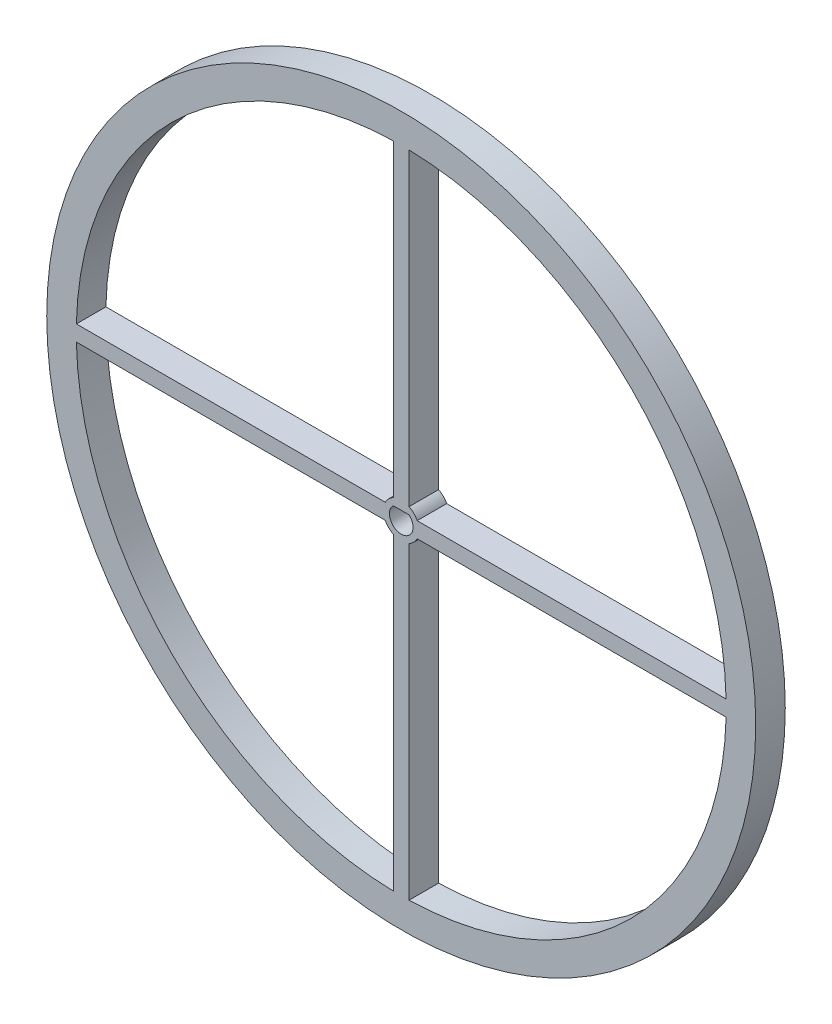
ISO-10303-21;
HEADER;
FILE_DESCRIPTION(('STEP AP214'),'2;1');
FILE_NAME('part.step','',(''),(''),'','','');
FILE_SCHEMA(('AUTOMOTIVE_DESIGN { 1 0 10303 214 1 1 1 1 }'));
ENDSEC;
DATA;
#1=APPLICATION_CONTEXT('core data for automotive mechanical design processes');
#2=APPLICATION_PROTOCOL_DEFINITION('international standard','automotive_design',2000,#1);
#3=PRODUCT_CONTEXT('',#1,'mechanical');
#4=PRODUCT('Part','Part','',(#3));
#5=PRODUCT_RELATED_PRODUCT_CATEGORY('part','',(#4));
#6=PRODUCT_DEFINITION_FORMATION('','',#4);
#7=PRODUCT_DEFINITION_CONTEXT('part definition',#1,'design');
#8=PRODUCT_DEFINITION('design','',#6,#7);
#9=PRODUCT_DEFINITION_SHAPE('','',#8);
#10=(LENGTH_UNIT() NAMED_UNIT(*) SI_UNIT(.MILLI.,.METRE.));
#11=(NAMED_UNIT(*) PLANE_ANGLE_UNIT() SI_UNIT($,.RADIAN.));
#12=(NAMED_UNIT(*) SI_UNIT($,.STERADIAN.) SOLID_ANGLE_UNIT());
#13=UNCERTAINTY_MEASURE_WITH_UNIT(LENGTH_MEASURE(1.E-05),#10,'distance_accuracy_value','');
#14=(GEOMETRIC_REPRESENTATION_CONTEXT(3) GLOBAL_UNCERTAINTY_ASSIGNED_CONTEXT((#13)) GLOBAL_UNIT_ASSIGNED_CONTEXT((#10,
#11,#12)) REPRESENTATION_CONTEXT('',''));
#15=CARTESIAN_POINT('',(0.,0.,0.));
#16=DIRECTION('',(0.,0.,1.));
#17=DIRECTION('',(1.,0.,0.));
#18=AXIS2_PLACEMENT_3D('',#15,#16,#17);
#19=CARTESIAN_POINT('',(0.,0.,5.));
#20=DIRECTION('',(0.,0.,-1.));
#21=DIRECTION('',(-1.,0.,0.));
#22=AXIS2_PLACEMENT_3D('',#19,#20,#21);
#23=CYLINDRICAL_SURFACE('',#22,2.);
#24=CARTESIAN_POINT('',(0.,0.,0.));
#25=DIRECTION('',(0.,0.,1.));
#26=DIRECTION('',(1.,0.,0.));
#27=AXIS2_PLACEMENT_3D('',#24,#25,#26);
#28=CIRCLE('',#27,2.);
#29=CARTESIAN_POINT('',(-1.325,1.49812382665786,0.));
#30=VERTEX_POINT('',#29);
#31=CARTESIAN_POINT('',(1.325,1.49812382665786,0.));
#32=VERTEX_POINT('',#31);
#33=EDGE_CURVE('E274',#30,#32,#28,.T.);
#34=ORIENTED_EDGE('',*,*,#33,.F.);
#35=DIRECTION('',(0.,0.,-1.));
#36=VECTOR('',#35,1.);
#37=CARTESIAN_POINT('',(-1.325,1.49812382665786,5.));
#38=LINE('',#37,#36);
#39=CARTESIAN_POINT('',(-1.325,1.49812382665786,5.));
#40=VERTEX_POINT('',#39);
#41=EDGE_CURVE('E11',#40,#30,#38,.T.);
#42=ORIENTED_EDGE('',*,*,#41,.F.);
#43=CARTESIAN_POINT('',(0.,0.,5.));
#44=DIRECTION('',(0.,0.,1.));
#45=DIRECTION('',(1.,0.,0.));
#46=AXIS2_PLACEMENT_3D('',#43,#44,#45);
#47=CIRCLE('',#46,2.);
#48=CARTESIAN_POINT('',(1.325,1.49812382665786,5.));
#49=VERTEX_POINT('',#48);
#50=EDGE_CURVE('E207',#40,#49,#47,.T.);
#51=ORIENTED_EDGE('',*,*,#50,.T.);
#52=DIRECTION('',(0.,0.,-1.));
#53=VECTOR('',#52,1.);
#54=CARTESIAN_POINT('',(1.325,1.49812382665786,5.));
#55=LINE('',#54,#53);
#56=EDGE_CURVE('E50',#49,#32,#55,.T.);
#57=ORIENTED_EDGE('',*,*,#56,.T.);
#58=EDGE_LOOP('',(#34,#42,#51,#57));
#59=FACE_BOUND('',#58,.T.);
#60=ADVANCED_FACE('F39',(#59),#23,.F.);
#61=CARTESIAN_POINT('',(0.,0.,5.));
#62=DIRECTION('',(0.,0.,-1.));
#63=DIRECTION('',(-1.,0.,0.));
#64=AXIS2_PLACEMENT_3D('',#61,#62,#63);
#65=CYLINDRICAL_SURFACE('',#64,3.);
#66=CARTESIAN_POINT('',(0.,0.,0.));
#67=DIRECTION('',(0.,0.,1.));
#68=DIRECTION('',(1.,0.,0.));
#69=AXIS2_PLACEMENT_3D('',#66,#67,#68);
#70=CIRCLE('',#69,3.);
#71=CARTESIAN_POINT('',(2.69153766460735,1.325,0.));
#72=VERTEX_POINT('',#71);
#73=CARTESIAN_POINT('',(1.325,2.69153766460735,0.));
#74=VERTEX_POINT('',#73);
#75=EDGE_CURVE('E226',#72,#74,#70,.T.);
#76=ORIENTED_EDGE('',*,*,#75,.T.);
#77=DIRECTION('',(0.,0.,-1.));
#78=VECTOR('',#77,1.);
#79=CARTESIAN_POINT('',(1.325,2.69153766460735,5.));
#80=LINE('',#79,#78);
#81=CARTESIAN_POINT('',(1.325,2.69153766460735,5.));
#82=VERTEX_POINT('',#81);
#83=EDGE_CURVE('E189',#82,#74,#80,.T.);
#84=ORIENTED_EDGE('',*,*,#83,.F.);
#85=CARTESIAN_POINT('',(0.,0.,5.));
#86=DIRECTION('',(0.,0.,1.));
#87=DIRECTION('',(1.,0.,0.));
#88=AXIS2_PLACEMENT_3D('',#85,#86,#87);
#89=CIRCLE('',#88,3.);
#90=CARTESIAN_POINT('',(2.69153766460735,1.325,5.));
#91=VERTEX_POINT('',#90);
#92=EDGE_CURVE('E186',#91,#82,#89,.T.);
#93=ORIENTED_EDGE('',*,*,#92,.F.);
#94=DIRECTION('',(0.,0.,-1.));
#95=VECTOR('',#94,1.);
#96=CARTESIAN_POINT('',(2.69153766460735,1.325,5.));
#97=LINE('',#96,#95);
#98=EDGE_CURVE('E170',#91,#72,#97,.T.);
#99=ORIENTED_EDGE('',*,*,#98,.T.);
#100=EDGE_LOOP('',(#76,#84,#93,#99));
#101=FACE_BOUND('',#100,.T.);
#102=ADVANCED_FACE('F187',(#101),#65,.T.);
#103=CARTESIAN_POINT('',(1.325,0.,5.));
#104=DIRECTION('',(-1.,0.,0.));
#105=DIRECTION('',(0.,0.,1.));
#106=AXIS2_PLACEMENT_3D('',#103,#104,#105);
#107=PLANE('',#106);
#108=DIRECTION('',(0.,1.,0.));
#109=VECTOR('',#108,1.);
#110=CARTESIAN_POINT('',(1.325,0.,0.));
#111=LINE('',#110,#109);
#112=CARTESIAN_POINT('',(1.325,54.9840374563382,0.));
#113=VERTEX_POINT('',#112);
#114=EDGE_CURVE('E260',#74,#113,#111,.T.);
#115=ORIENTED_EDGE('',*,*,#114,.T.);
#116=DIRECTION('',(0.,0.,-1.));
#117=VECTOR('',#116,1.);
#118=CARTESIAN_POINT('',(1.325,54.9840374563382,5.));
#119=LINE('',#118,#117);
#120=CARTESIAN_POINT('',(1.325,54.9840374563382,5.));
#121=VERTEX_POINT('',#120);
#122=EDGE_CURVE('E286',#121,#113,#119,.T.);
#123=ORIENTED_EDGE('',*,*,#122,.F.);
#124=DIRECTION('',(0.,1.,0.));
#125=VECTOR('',#124,1.);
#126=CARTESIAN_POINT('',(1.325,0.,5.));
#127=LINE('',#126,#125);
#128=EDGE_CURVE('E192',#82,#121,#127,.T.);
#129=ORIENTED_EDGE('',*,*,#128,.F.);
#130=ORIENTED_EDGE('',*,*,#83,.T.);
#131=EDGE_LOOP('',(#115,#123,#129,#130));
#132=FACE_BOUND('',#131,.T.);
#133=ADVANCED_FACE('F358',(#132),#107,.F.);
#134=CARTESIAN_POINT('',(0.,0.,5.));
#135=DIRECTION('',(0.,0.,-1.));
#136=DIRECTION('',(-1.,0.,0.));
#137=AXIS2_PLACEMENT_3D('',#134,#135,#136);
#138=CYLINDRICAL_SURFACE('',#137,55.);
#139=CARTESIAN_POINT('',(0.,0.,0.));
#140=DIRECTION('',(0.,0.,1.));
#141=DIRECTION('',(1.,0.,0.));
#142=AXIS2_PLACEMENT_3D('',#139,#140,#141);
#143=CIRCLE('',#142,55.);
#144=CARTESIAN_POINT('',(54.9840374563382,1.325,0.));
#145=VERTEX_POINT('',#144);
#146=EDGE_CURVE('E264',#145,#113,#143,.T.);
#147=ORIENTED_EDGE('',*,*,#146,.F.);
#148=DIRECTION('',(0.,0.,-1.));
#149=VECTOR('',#148,1.);
#150=CARTESIAN_POINT('',(54.9840374563382,1.325,5.));
#151=LINE('',#150,#149);
#152=CARTESIAN_POINT('',(54.9840374563382,1.325,5.));
#153=VERTEX_POINT('',#152);
#154=EDGE_CURVE('E181',#153,#145,#151,.T.);
#155=ORIENTED_EDGE('',*,*,#154,.F.);
#156=CARTESIAN_POINT('',(0.,0.,5.));
#157=DIRECTION('',(0.,0.,1.));
#158=DIRECTION('',(1.,0.,0.));
#159=AXIS2_PLACEMENT_3D('',#156,#157,#158);
#160=CIRCLE('',#159,55.);
#161=EDGE_CURVE('E200',#153,#121,#160,.T.);
#162=ORIENTED_EDGE('',*,*,#161,.T.);
#163=ORIENTED_EDGE('',*,*,#122,.T.);
#164=EDGE_LOOP('',(#147,#155,#162,#163));
#165=FACE_BOUND('',#164,.T.);
#166=ADVANCED_FACE('F367',(#165),#138,.F.);
#167=CARTESIAN_POINT('',(-1.325,0.,5.));
#168=DIRECTION('',(-1.,0.,0.));
#169=DIRECTION('',(0.,0.,1.));
#170=AXIS2_PLACEMENT_3D('',#167,#168,#169);
#171=PLANE('',#170);
#172=DIRECTION('',(0.,1.,0.));
#173=VECTOR('',#172,1.);
#174=CARTESIAN_POINT('',(-1.325,0.,0.));
#175=LINE('',#174,#173);
#176=CARTESIAN_POINT('',(-1.325,2.69153766460735,0.));
#177=VERTEX_POINT('',#176);
#178=CARTESIAN_POINT('',(-1.325,54.9840374563382,0.));
#179=VERTEX_POINT('',#178);
#180=EDGE_CURVE('E247',#177,#179,#175,.T.);
#181=ORIENTED_EDGE('',*,*,#180,.F.);
#182=DIRECTION('',(0.,0.,-1.));
#183=VECTOR('',#182,1.);
#184=CARTESIAN_POINT('',(-1.325,2.69153766460735,5.));
#185=LINE('',#184,#183);
#186=CARTESIAN_POINT('',(-1.325,2.69153766460735,5.));
#187=VERTEX_POINT('',#186);
#188=EDGE_CURVE('E182',#187,#177,#185,.T.);
#189=ORIENTED_EDGE('',*,*,#188,.F.);
#190=DIRECTION('',(0.,1.,0.));
#191=VECTOR('',#190,1.);
#192=CARTESIAN_POINT('',(-1.325,0.,5.));
#193=LINE('',#192,#191);
#194=CARTESIAN_POINT('',(-1.325,54.9840374563382,5.));
#195=VERTEX_POINT('',#194);
#196=EDGE_CURVE('E555',#187,#195,#193,.T.);
#197=ORIENTED_EDGE('',*,*,#196,.T.);
#198=DIRECTION('',(0.,0.,-1.));
#199=VECTOR('',#198,1.);
#200=CARTESIAN_POINT('',(-1.325,54.9840374563382,5.));
#201=LINE('',#200,#199);
#202=EDGE_CURVE('E291',#195,#179,#201,.T.);
#203=ORIENTED_EDGE('',*,*,#202,.T.);
#204=EDGE_LOOP('',(#181,#189,#197,#203));
#205=FACE_BOUND('',#204,.T.);
#206=ADVANCED_FACE('F370',(#205),#171,.T.);
#207=CARTESIAN_POINT('',(-2.69153766460735,1.325,0.));
#208=VERTEX_POINT('',#207);
#209=EDGE_CURVE('E251',#177,#208,#70,.T.);
#210=ORIENTED_EDGE('',*,*,#209,.T.);
#211=DIRECTION('',(0.,0.,-1.));
#212=VECTOR('',#211,1.);
#213=CARTESIAN_POINT('',(-2.69153766460735,1.325,5.));
#214=LINE('',#213,#212);
#215=CARTESIAN_POINT('',(-2.69153766460735,1.325,5.));
#216=VERTEX_POINT('',#215);
#217=EDGE_CURVE('E298',#216,#208,#214,.T.);
#218=ORIENTED_EDGE('',*,*,#217,.F.);
#219=EDGE_CURVE('E195',#187,#216,#89,.T.);
#220=ORIENTED_EDGE('',*,*,#219,.F.);
#221=ORIENTED_EDGE('',*,*,#188,.T.);
#222=EDGE_LOOP('',(#210,#218,#220,#221));
#223=FACE_BOUND('',#222,.T.);
#224=ADVANCED_FACE('F359',(#223),#65,.T.);
#225=CARTESIAN_POINT('',(0.,1.325,5.));
#226=DIRECTION('',(0.,1.,0.));
#227=DIRECTION('',(0.,0.,1.));
#228=AXIS2_PLACEMENT_3D('',#225,#226,#227);
#229=PLANE('',#228);
#230=DIRECTION('',(1.,0.,0.));
#231=VECTOR('',#230,1.);
#232=CARTESIAN_POINT('',(0.,1.325,0.));
#233=LINE('',#232,#231);
#234=CARTESIAN_POINT('',(-54.9840374563382,1.325,0.));
#235=VERTEX_POINT('',#234);
#236=EDGE_CURVE('E252',#235,#208,#233,.T.);
#237=ORIENTED_EDGE('',*,*,#236,.F.);
#238=DIRECTION('',(0.,0.,-1.));
#239=VECTOR('',#238,1.);
#240=CARTESIAN_POINT('',(-54.9840374563382,1.325,5.));
#241=LINE('',#240,#239);
#242=CARTESIAN_POINT('',(-54.9840374563382,1.325,5.));
#243=VERTEX_POINT('',#242);
#244=EDGE_CURVE('E294',#243,#235,#241,.T.);
#245=ORIENTED_EDGE('',*,*,#244,.F.);
#246=DIRECTION('',(1.,0.,0.));
#247=VECTOR('',#246,1.);
#248=CARTESIAN_POINT('',(0.,1.325,5.));
#249=LINE('',#248,#247);
#250=EDGE_CURVE('E546',#243,#216,#249,.T.);
#251=ORIENTED_EDGE('',*,*,#250,.T.);
#252=ORIENTED_EDGE('',*,*,#217,.T.);
#253=EDGE_LOOP('',(#237,#245,#251,#252));
#254=FACE_BOUND('',#253,.T.);
#255=ADVANCED_FACE('F379',(#254),#229,.T.);
#256=CARTESIAN_POINT('',(0.,-1.325,5.));
#257=DIRECTION('',(0.,1.,0.));
#258=DIRECTION('',(0.,0.,1.));
#259=AXIS2_PLACEMENT_3D('',#256,#257,#258);
#260=PLANE('',#259);
#261=DIRECTION('',(1.,0.,0.));
#262=VECTOR('',#261,1.);
#263=CARTESIAN_POINT('',(0.,-1.325,0.));
#264=LINE('',#263,#262);
#265=CARTESIAN_POINT('',(-54.9840374563382,-1.325,0.));
#266=VERTEX_POINT('',#265);
#267=CARTESIAN_POINT('',(-2.69153766460735,-1.325,0.));
#268=VERTEX_POINT('',#267);
#269=EDGE_CURVE('E235',#266,#268,#264,.T.);
#270=ORIENTED_EDGE('',*,*,#269,.T.);
#271=DIRECTION('',(0.,0.,-1.));
#272=VECTOR('',#271,1.);
#273=CARTESIAN_POINT('',(-2.69153766460735,-1.325,5.));
#274=LINE('',#273,#272);
#275=CARTESIAN_POINT('',(-2.69153766460735,-1.325,5.));
#276=VERTEX_POINT('',#275);
#277=EDGE_CURVE('E295',#276,#268,#274,.T.);
#278=ORIENTED_EDGE('',*,*,#277,.F.);
#279=DIRECTION('',(1.,0.,0.));
#280=VECTOR('',#279,1.);
#281=CARTESIAN_POINT('',(0.,-1.325,5.));
#282=LINE('',#281,#280);
#283=CARTESIAN_POINT('',(-54.9840374563382,-1.325,5.));
#284=VERTEX_POINT('',#283);
#285=EDGE_CURVE('E582',#284,#276,#282,.T.);
#286=ORIENTED_EDGE('',*,*,#285,.F.);
#287=DIRECTION('',(0.,0.,-1.));
#288=VECTOR('',#287,1.);
#289=CARTESIAN_POINT('',(-54.9840374563382,-1.325,5.));
#290=LINE('',#289,#288);
#291=EDGE_CURVE('E303',#284,#266,#290,.T.);
#292=ORIENTED_EDGE('',*,*,#291,.T.);
#293=EDGE_LOOP('',(#270,#278,#286,#292));
#294=FACE_BOUND('',#293,.T.);
#295=ADVANCED_FACE('F382',(#294),#260,.F.);
#296=CARTESIAN_POINT('',(-1.325,-2.69153766460735,0.));
#297=VERTEX_POINT('',#296);
#298=EDGE_CURVE('E227',#268,#297,#70,.T.);
#299=ORIENTED_EDGE('',*,*,#298,.T.);
#300=DIRECTION('',(0.,0.,-1.));
#301=VECTOR('',#300,1.);
#302=CARTESIAN_POINT('',(-1.325,-2.69153766460735,5.));
#303=LINE('',#302,#301);
#304=CARTESIAN_POINT('',(-1.325,-2.69153766460735,5.));
#305=VERTEX_POINT('',#304);
#306=EDGE_CURVE('E309',#305,#297,#303,.T.);
#307=ORIENTED_EDGE('',*,*,#306,.F.);
#308=EDGE_CURVE('E556',#276,#305,#89,.T.);
#309=ORIENTED_EDGE('',*,*,#308,.F.);
#310=ORIENTED_EDGE('',*,*,#277,.T.);
#311=EDGE_LOOP('',(#299,#307,#309,#310));
#312=FACE_BOUND('',#311,.T.);
#313=ADVANCED_FACE('F351',(#312),#65,.T.);
#314=CARTESIAN_POINT('',(-1.325,0.,5.));
#315=DIRECTION('',(-1.,0.,0.));
#316=DIRECTION('',(0.,0.,1.));
#317=AXIS2_PLACEMENT_3D('',#314,#315,#316);
#318=PLANE('',#317);
#319=DIRECTION('',(0.,1.,0.));
#320=VECTOR('',#319,1.);
#321=CARTESIAN_POINT('',(-1.325,0.,0.));
#322=LINE('',#321,#320);
#323=CARTESIAN_POINT('',(-1.325,-54.9840374563382,0.));
#324=VERTEX_POINT('',#323);
#325=EDGE_CURVE('E239',#324,#297,#322,.T.);
#326=ORIENTED_EDGE('',*,*,#325,.F.);
#327=DIRECTION('',(0.,0.,-1.));
#328=VECTOR('',#327,1.);
#329=CARTESIAN_POINT('',(-1.325,-54.9840374563382,5.));
#330=LINE('',#329,#328);
#331=CARTESIAN_POINT('',(-1.325,-54.9840374563382,5.));
#332=VERTEX_POINT('',#331);
#333=EDGE_CURVE('E306',#332,#324,#330,.T.);
#334=ORIENTED_EDGE('',*,*,#333,.F.);
#335=DIRECTION('',(0.,1.,0.));
#336=VECTOR('',#335,1.);
#337=CARTESIAN_POINT('',(-1.325,0.,5.));
#338=LINE('',#337,#336);
#339=EDGE_CURVE('E573',#332,#305,#338,.T.);
#340=ORIENTED_EDGE('',*,*,#339,.T.);
#341=ORIENTED_EDGE('',*,*,#306,.T.);
#342=EDGE_LOOP('',(#326,#334,#340,#341));
#343=FACE_BOUND('',#342,.T.);
#344=ADVANCED_FACE('F390',(#343),#318,.T.);
#345=CARTESIAN_POINT('',(1.325,0.,5.));
#346=DIRECTION('',(-1.,0.,0.));
#347=DIRECTION('',(0.,0.,1.));
#348=AXIS2_PLACEMENT_3D('',#345,#346,#347);
#349=PLANE('',#348);
#350=DIRECTION('',(0.,1.,0.));
#351=VECTOR('',#350,1.);
#352=CARTESIAN_POINT('',(1.325,0.,0.));
#353=LINE('',#352,#351);
#354=CARTESIAN_POINT('',(1.325,-54.9840374563382,0.));
#355=VERTEX_POINT('',#354);
#356=CARTESIAN_POINT('',(1.325,-2.69153766460735,0.));
#357=VERTEX_POINT('',#356);
#358=EDGE_CURVE('E218',#355,#357,#353,.T.);
#359=ORIENTED_EDGE('',*,*,#358,.T.);
#360=DIRECTION('',(0.,0.,-1.));
#361=VECTOR('',#360,1.);
#362=CARTESIAN_POINT('',(1.325,-2.69153766460735,5.));
#363=LINE('',#362,#361);
#364=CARTESIAN_POINT('',(1.325,-2.69153766460735,5.));
#365=VERTEX_POINT('',#364);
#366=EDGE_CURVE('E43',#365,#357,#363,.T.);
#367=ORIENTED_EDGE('',*,*,#366,.F.);
#368=DIRECTION('',(0.,1.,0.));
#369=VECTOR('',#368,1.);
#370=CARTESIAN_POINT('',(1.325,0.,5.));
#371=LINE('',#370,#369);
#372=CARTESIAN_POINT('',(1.325,-54.9840374563382,5.));
#373=VERTEX_POINT('',#372);
#374=EDGE_CURVE('E281',#373,#365,#371,.T.);
#375=ORIENTED_EDGE('',*,*,#374,.F.);
#376=DIRECTION('',(0.,0.,-1.));
#377=VECTOR('',#376,1.);
#378=CARTESIAN_POINT('',(1.325,-54.9840374563382,5.));
#379=LINE('',#378,#377);
#380=EDGE_CURVE('E217',#373,#355,#379,.T.);
#381=ORIENTED_EDGE('',*,*,#380,.T.);
#382=EDGE_LOOP('',(#359,#367,#375,#381));
#383=FACE_BOUND('',#382,.T.);
#384=ADVANCED_FACE('F41',(#383),#349,.F.);
#385=CARTESIAN_POINT('',(2.69153766460735,-1.325,0.));
#386=VERTEX_POINT('',#385);
#387=EDGE_CURVE('E222',#357,#386,#70,.T.);
#388=ORIENTED_EDGE('',*,*,#387,.T.);
#389=DIRECTION('',(0.,0.,-1.));
#390=VECTOR('',#389,1.);
#391=CARTESIAN_POINT('',(2.69153766460735,-1.325,5.));
#392=LINE('',#391,#390);
#393=CARTESIAN_POINT('',(2.69153766460735,-1.325,5.));
#394=VERTEX_POINT('',#393);
#395=EDGE_CURVE('E319',#394,#386,#392,.T.);
#396=ORIENTED_EDGE('',*,*,#395,.F.);
#397=EDGE_CURVE('E124',#365,#394,#89,.T.);
#398=ORIENTED_EDGE('',*,*,#397,.F.);
#399=ORIENTED_EDGE('',*,*,#366,.T.);
#400=EDGE_LOOP('',(#388,#396,#398,#399));
#401=FACE_BOUND('',#400,.T.);
#402=ADVANCED_FACE('F327',(#401),#65,.T.);
#403=CARTESIAN_POINT('',(0.,-1.325,5.));
#404=DIRECTION('',(0.,1.,0.));
#405=DIRECTION('',(0.,0.,1.));
#406=AXIS2_PLACEMENT_3D('',#403,#404,#405);
#407=PLANE('',#406);
#408=DIRECTION('',(1.,0.,0.));
#409=VECTOR('',#408,1.);
#410=CARTESIAN_POINT('',(0.,-1.325,0.));
#411=LINE('',#410,#409);
#412=CARTESIAN_POINT('',(54.9840374563382,-1.325,0.));
#413=VERTEX_POINT('',#412);
#414=EDGE_CURVE('E225',#386,#413,#411,.T.);
#415=ORIENTED_EDGE('',*,*,#414,.T.);
#416=DIRECTION('',(0.,0.,-1.));
#417=VECTOR('',#416,1.);
#418=CARTESIAN_POINT('',(54.9840374563382,-1.325,5.));
#419=LINE('',#418,#417);
#420=CARTESIAN_POINT('',(54.9840374563382,-1.325,5.));
#421=VERTEX_POINT('',#420);
#422=EDGE_CURVE('E317',#421,#413,#419,.T.);
#423=ORIENTED_EDGE('',*,*,#422,.F.);
#424=DIRECTION('',(1.,0.,0.));
#425=VECTOR('',#424,1.);
#426=CARTESIAN_POINT('',(0.,-1.325,5.));
#427=LINE('',#426,#425);
#428=EDGE_CURVE('E589',#394,#421,#427,.T.);
#429=ORIENTED_EDGE('',*,*,#428,.F.);
#430=ORIENTED_EDGE('',*,*,#395,.T.);
#431=EDGE_LOOP('',(#415,#423,#429,#430));
#432=FACE_BOUND('',#431,.T.);
#433=ADVANCED_FACE('F341',(#432),#407,.F.);
#434=CARTESIAN_POINT('',(0.,0.,5.));
#435=DIRECTION('',(0.,0.,-1.));
#436=DIRECTION('',(-1.,0.,0.));
#437=AXIS2_PLACEMENT_3D('',#434,#435,#436);
#438=CYLINDRICAL_SURFACE('',#437,60.);
#439=CARTESIAN_POINT('',(0.,0.,5.));
#440=DIRECTION('',(0.,0.,1.));
#441=DIRECTION('',(1.,0.,0.));
#442=AXIS2_PLACEMENT_3D('',#439,#440,#441);
#443=CIRCLE('',#442,60.);
#444=CARTESIAN_POINT('',(60.,0.,5.));
#445=VERTEX_POINT('',#444);
#446=EDGE_CURVE('E202',#445,#445,#443,.T.);
#447=ORIENTED_EDGE('',*,*,#446,.F.);
#448=EDGE_LOOP('',(#447));
#449=FACE_BOUND('',#448,.T.);
#450=CARTESIAN_POINT('',(0.,0.,0.));
#451=DIRECTION('',(0.,0.,1.));
#452=DIRECTION('',(1.,0.,0.));
#453=AXIS2_PLACEMENT_3D('',#450,#451,#452);
#454=CIRCLE('',#453,60.);
#455=CARTESIAN_POINT('',(60.,0.,0.));
#456=VERTEX_POINT('',#455);
#457=EDGE_CURVE('E270',#456,#456,#454,.T.);
#458=ORIENTED_EDGE('',*,*,#457,.T.);
#459=EDGE_LOOP('',(#458));
#460=FACE_BOUND('',#459,.T.);
#461=ADVANCED_FACE('F343',(#449,#460),#438,.T.);
#462=CARTESIAN_POINT('',(0.,1.325,5.));
#463=DIRECTION('',(0.,1.,0.));
#464=DIRECTION('',(-1.,0.,0.));
#465=AXIS2_PLACEMENT_3D('',#462,#463,#464);
#466=PLANE('',#465);
#467=DIRECTION('',(1.,0.,0.));
#468=VECTOR('',#467,1.);
#469=CARTESIAN_POINT('',(0.,1.325,0.));
#470=LINE('',#469,#468);
#471=EDGE_CURVE('E176',#72,#145,#470,.T.);
#472=ORIENTED_EDGE('',*,*,#471,.F.);
#473=ORIENTED_EDGE('',*,*,#98,.F.);
#474=DIRECTION('',(1.,0.,0.));
#475=VECTOR('',#474,1.);
#476=CARTESIAN_POINT('',(0.,1.325,5.));
#477=LINE('',#476,#475);
#478=EDGE_CURVE('E174',#91,#153,#477,.T.);
#479=ORIENTED_EDGE('',*,*,#478,.T.);
#480=ORIENTED_EDGE('',*,*,#154,.T.);
#481=EDGE_LOOP('',(#472,#473,#479,#480));
#482=FACE_BOUND('',#481,.T.);
#483=ADVANCED_FACE('F172',(#482),#466,.T.);
#484=CARTESIAN_POINT('',(0.,0.,5.));
#485=DIRECTION('',(0.,0.,-1.));
#486=DIRECTION('',(-1.,0.,0.));
#487=AXIS2_PLACEMENT_3D('',#484,#485,#486);
#488=CYLINDRICAL_SURFACE('',#487,55.);
#489=CARTESIAN_POINT('',(0.,0.,0.));
#490=DIRECTION('',(0.,0.,1.));
#491=DIRECTION('',(1.,0.,0.));
#492=AXIS2_PLACEMENT_3D('',#489,#490,#491);
#493=CIRCLE('',#492,55.);
#494=EDGE_CURVE('E256',#179,#235,#493,.T.);
#495=ORIENTED_EDGE('',*,*,#494,.F.);
#496=ORIENTED_EDGE('',*,*,#202,.F.);
#497=CARTESIAN_POINT('',(0.,0.,5.));
#498=DIRECTION('',(0.,0.,1.));
#499=DIRECTION('',(1.,0.,0.));
#500=AXIS2_PLACEMENT_3D('',#497,#498,#499);
#501=CIRCLE('',#500,55.);
#502=EDGE_CURVE('E193',#195,#243,#501,.T.);
#503=ORIENTED_EDGE('',*,*,#502,.T.);
#504=ORIENTED_EDGE('',*,*,#244,.T.);
#505=EDGE_LOOP('',(#495,#496,#503,#504));
#506=FACE_BOUND('',#505,.T.);
#507=ADVANCED_FACE('F366',(#506),#488,.F.);
#508=CARTESIAN_POINT('',(0.,0.,5.));
#509=DIRECTION('',(0.,0.,-1.));
#510=DIRECTION('',(-1.,0.,0.));
#511=AXIS2_PLACEMENT_3D('',#508,#509,#510);
#512=CYLINDRICAL_SURFACE('',#511,55.);
#513=CARTESIAN_POINT('',(0.,0.,0.));
#514=DIRECTION('',(0.,0.,1.));
#515=DIRECTION('',(1.,0.,0.));
#516=AXIS2_PLACEMENT_3D('',#513,#514,#515);
#517=CIRCLE('',#516,55.);
#518=EDGE_CURVE('E243',#266,#324,#517,.T.);
#519=ORIENTED_EDGE('',*,*,#518,.F.);
#520=ORIENTED_EDGE('',*,*,#291,.F.);
#521=CARTESIAN_POINT('',(0.,0.,5.));
#522=DIRECTION('',(0.,0.,1.));
#523=DIRECTION('',(1.,0.,0.));
#524=AXIS2_PLACEMENT_3D('',#521,#522,#523);
#525=CIRCLE('',#524,55.);
#526=EDGE_CURVE('E578',#284,#332,#525,.T.);
#527=ORIENTED_EDGE('',*,*,#526,.T.);
#528=ORIENTED_EDGE('',*,*,#333,.T.);
#529=EDGE_LOOP('',(#519,#520,#527,#528));
#530=FACE_BOUND('',#529,.T.);
#531=ADVANCED_FACE('F377',(#530),#512,.F.);
#532=CARTESIAN_POINT('',(0.,0.,5.));
#533=DIRECTION('',(0.,0.,-1.));
#534=DIRECTION('',(-1.,0.,0.));
#535=AXIS2_PLACEMENT_3D('',#532,#533,#534);
#536=CYLINDRICAL_SURFACE('',#535,55.);
#537=CARTESIAN_POINT('',(0.,0.,0.));
#538=DIRECTION('',(0.,0.,1.));
#539=DIRECTION('',(1.,0.,0.));
#540=AXIS2_PLACEMENT_3D('',#537,#538,#539);
#541=CIRCLE('',#540,55.);
#542=EDGE_CURVE('E231',#355,#413,#541,.T.);
#543=ORIENTED_EDGE('',*,*,#542,.F.);
#544=ORIENTED_EDGE('',*,*,#380,.F.);
#545=CARTESIAN_POINT('',(0.,0.,5.));
#546=DIRECTION('',(0.,0.,1.));
#547=DIRECTION('',(1.,0.,0.));
#548=AXIS2_PLACEMENT_3D('',#545,#546,#547);
#549=CIRCLE('',#548,55.);
#550=EDGE_CURVE('E340',#373,#421,#549,.T.);
#551=ORIENTED_EDGE('',*,*,#550,.T.);
#552=ORIENTED_EDGE('',*,*,#422,.T.);
#553=EDGE_LOOP('',(#543,#544,#551,#552));
#554=FACE_BOUND('',#553,.T.);
#555=ADVANCED_FACE('F336',(#554),#536,.F.);
#556=CARTESIAN_POINT('',(0.,1.49812382665786,5.));
#557=DIRECTION('',(0.,-1.,0.));
#558=DIRECTION('',(0.,0.,-1.));
#559=AXIS2_PLACEMENT_3D('',#556,#557,#558);
#560=PLANE('',#559);
#561=DIRECTION('',(-1.,0.,0.));
#562=VECTOR('',#561,1.);
#563=CARTESIAN_POINT('',(0.,1.49812382665786,0.));
#564=LINE('',#563,#562);
#565=EDGE_CURVE('E277',#32,#30,#564,.T.);
#566=ORIENTED_EDGE('',*,*,#565,.F.);
#567=ORIENTED_EDGE('',*,*,#56,.F.);
#568=DIRECTION('',(-1.,0.,0.));
#569=VECTOR('',#568,1.);
#570=CARTESIAN_POINT('',(0.,1.49812382665786,5.));
#571=LINE('',#570,#569);
#572=EDGE_CURVE('E214',#49,#40,#571,.T.);
#573=ORIENTED_EDGE('',*,*,#572,.T.);
#574=ORIENTED_EDGE('',*,*,#41,.T.);
#575=EDGE_LOOP('',(#566,#567,#573,#574));
#576=FACE_BOUND('',#575,.T.);
#577=ADVANCED_FACE('F361',(#576),#560,.T.);
#578=CARTESIAN_POINT('',(0.,0.,5.));
#579=DIRECTION('',(0.,0.,1.));
#580=DIRECTION('',(1.,0.,0.));
#581=AXIS2_PLACEMENT_3D('',#578,#579,#580);
#582=PLANE('',#581);
#583=ORIENTED_EDGE('',*,*,#374,.T.);
#584=ORIENTED_EDGE('',*,*,#397,.T.);
#585=ORIENTED_EDGE('',*,*,#428,.T.);
#586=ORIENTED_EDGE('',*,*,#550,.F.);
#587=EDGE_LOOP('',(#583,#584,#585,#586));
#588=FACE_BOUND('',#587,.T.);
#589=ORIENTED_EDGE('',*,*,#285,.T.);
#590=ORIENTED_EDGE('',*,*,#308,.T.);
#591=ORIENTED_EDGE('',*,*,#339,.F.);
#592=ORIENTED_EDGE('',*,*,#526,.F.);
#593=EDGE_LOOP('',(#589,#590,#591,#592));
#594=FACE_BOUND('',#593,.T.);
#595=ORIENTED_EDGE('',*,*,#196,.F.);
#596=ORIENTED_EDGE('',*,*,#219,.T.);
#597=ORIENTED_EDGE('',*,*,#250,.F.);
#598=ORIENTED_EDGE('',*,*,#502,.F.);
#599=EDGE_LOOP('',(#595,#596,#597,#598));
#600=FACE_BOUND('',#599,.T.);
#601=ORIENTED_EDGE('',*,*,#92,.T.);
#602=ORIENTED_EDGE('',*,*,#128,.T.);
#603=ORIENTED_EDGE('',*,*,#161,.F.);
#604=ORIENTED_EDGE('',*,*,#478,.F.);
#605=EDGE_LOOP('',(#601,#602,#603,#604));
#606=FACE_BOUND('',#605,.T.);
#607=ORIENTED_EDGE('',*,*,#446,.T.);
#608=EDGE_LOOP('',(#607));
#609=FACE_BOUND('',#608,.T.);
#610=ORIENTED_EDGE('',*,*,#50,.F.);
#611=ORIENTED_EDGE('',*,*,#572,.F.);
#612=EDGE_LOOP('',(#610,#611));
#613=FACE_BOUND('',#612,.T.);
#614=ADVANCED_FACE('F197',(#588,#594,#600,#606,#609,#613),#582,.T.);
#615=CARTESIAN_POINT('',(0.,0.,0.));
#616=DIRECTION('',(0.,0.,1.));
#617=DIRECTION('',(1.,0.,0.));
#618=AXIS2_PLACEMENT_3D('',#615,#616,#617);
#619=PLANE('',#618);
#620=ORIENTED_EDGE('',*,*,#358,.F.);
#621=ORIENTED_EDGE('',*,*,#542,.T.);
#622=ORIENTED_EDGE('',*,*,#414,.F.);
#623=ORIENTED_EDGE('',*,*,#387,.F.);
#624=EDGE_LOOP('',(#620,#621,#622,#623));
#625=FACE_BOUND('',#624,.T.);
#626=ORIENTED_EDGE('',*,*,#269,.F.);
#627=ORIENTED_EDGE('',*,*,#518,.T.);
#628=ORIENTED_EDGE('',*,*,#325,.T.);
#629=ORIENTED_EDGE('',*,*,#298,.F.);
#630=EDGE_LOOP('',(#626,#627,#628,#629));
#631=FACE_BOUND('',#630,.T.);
#632=ORIENTED_EDGE('',*,*,#180,.T.);
#633=ORIENTED_EDGE('',*,*,#494,.T.);
#634=ORIENTED_EDGE('',*,*,#236,.T.);
#635=ORIENTED_EDGE('',*,*,#209,.F.);
#636=EDGE_LOOP('',(#632,#633,#634,#635));
#637=FACE_BOUND('',#636,.T.);
#638=ORIENTED_EDGE('',*,*,#75,.F.);
#639=ORIENTED_EDGE('',*,*,#471,.T.);
#640=ORIENTED_EDGE('',*,*,#146,.T.);
#641=ORIENTED_EDGE('',*,*,#114,.F.);
#642=EDGE_LOOP('',(#638,#639,#640,#641));
#643=FACE_BOUND('',#642,.T.);
#644=ORIENTED_EDGE('',*,*,#457,.F.);
#645=EDGE_LOOP('',(#644));
#646=FACE_BOUND('',#645,.T.);
#647=ORIENTED_EDGE('',*,*,#33,.T.);
#648=ORIENTED_EDGE('',*,*,#565,.T.);
#649=EDGE_LOOP('',(#647,#648));
#650=FACE_BOUND('',#649,.T.);
#651=ADVANCED_FACE('F333',(#625,#631,#637,#643,#646,#650),#619,.F.);
#652=CLOSED_SHELL('',(#60,#102,#133,#166,#206,#224,#255,#295,#313,#344,#384,#402,#433,#461,#483,
#507,#531,#555,#577,#614,#651));
#653=MANIFOLD_SOLID_BREP('B2',#652);
#654=ADVANCED_BREP_SHAPE_REPRESENTATION('',(#18,#653),#14);
#655=SHAPE_DEFINITION_REPRESENTATION(#9,#654);
ENDSEC;
END-ISO-10303-21;
